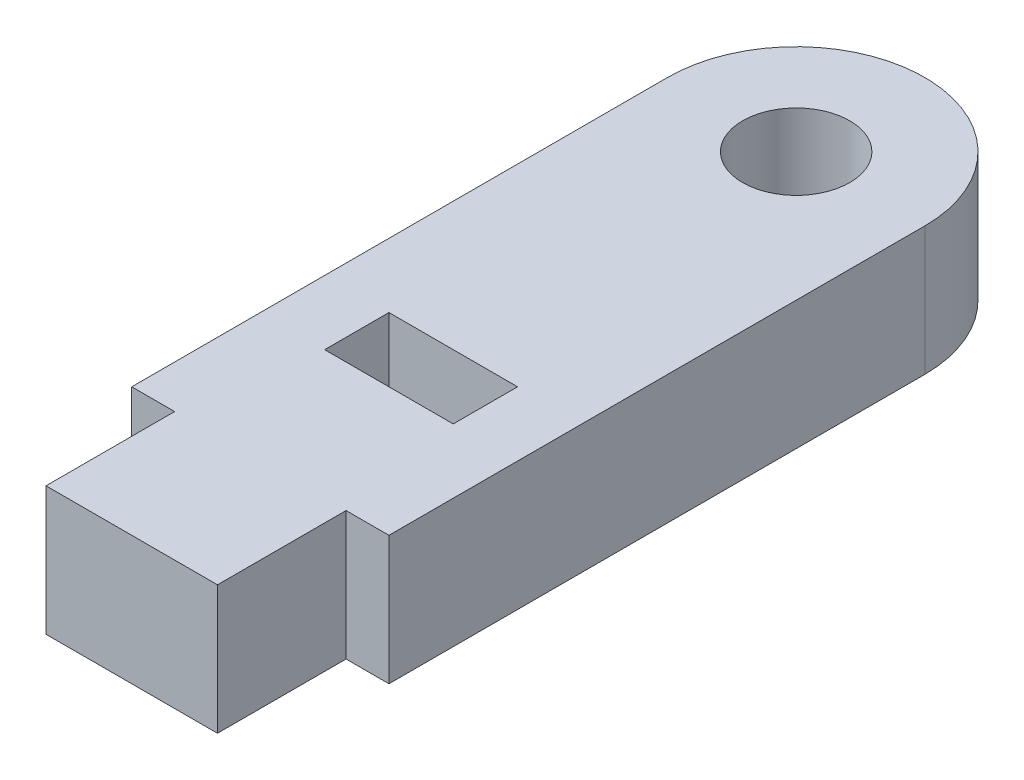
ISO-10303-21;
HEADER;
FILE_DESCRIPTION(('STEP AP214'),'2;1');
FILE_NAME('part.step','',(''),(''),'','','');
FILE_SCHEMA(('AUTOMOTIVE_DESIGN { 1 0 10303 214 1 1 1 1 }'));
ENDSEC;
DATA;
#1=APPLICATION_CONTEXT('core data for automotive mechanical design processes');
#2=APPLICATION_PROTOCOL_DEFINITION('international standard','automotive_design',2000,#1);
#3=PRODUCT_CONTEXT('',#1,'mechanical');
#4=PRODUCT('Part','Part','',(#3));
#5=PRODUCT_RELATED_PRODUCT_CATEGORY('part','',(#4));
#6=PRODUCT_DEFINITION_FORMATION('','',#4);
#7=PRODUCT_DEFINITION_CONTEXT('part definition',#1,'design');
#8=PRODUCT_DEFINITION('design','',#6,#7);
#9=PRODUCT_DEFINITION_SHAPE('','',#8);
#10=(LENGTH_UNIT() NAMED_UNIT(*) SI_UNIT(.MILLI.,.METRE.));
#11=(NAMED_UNIT(*) PLANE_ANGLE_UNIT() SI_UNIT($,.RADIAN.));
#12=(NAMED_UNIT(*) SI_UNIT($,.STERADIAN.) SOLID_ANGLE_UNIT());
#13=UNCERTAINTY_MEASURE_WITH_UNIT(LENGTH_MEASURE(1.E-05),#10,'distance_accuracy_value','');
#14=(GEOMETRIC_REPRESENTATION_CONTEXT(3) GLOBAL_UNCERTAINTY_ASSIGNED_CONTEXT((#13)) GLOBAL_UNIT_ASSIGNED_CONTEXT((#10,
#11,#12)) REPRESENTATION_CONTEXT('',''));
#15=CARTESIAN_POINT('',(0.,0.,0.));
#16=DIRECTION('',(0.,0.,1.));
#17=DIRECTION('',(1.,0.,0.));
#18=AXIS2_PLACEMENT_3D('',#15,#16,#17);
#19=CARTESIAN_POINT('',(0.,6.,0.));
#20=DIRECTION('',(0.,-1.,0.));
#21=DIRECTION('',(0.,0.,-1.));
#22=AXIS2_PLACEMENT_3D('',#19,#20,#21);
#23=PLANE('',#22);
#24=CARTESIAN_POINT('',(0.,6.,0.));
#25=DIRECTION('',(0.,1.,0.));
#26=DIRECTION('',(0.,0.,1.));
#27=AXIS2_PLACEMENT_3D('',#24,#25,#26);
#28=CIRCLE('',#27,2.5);
#29=CARTESIAN_POINT('',(0.,6.,2.5));
#30=VERTEX_POINT('',#29);
#31=EDGE_CURVE('E158',#30,#30,#28,.T.);
#32=ORIENTED_EDGE('',*,*,#31,.F.);
#33=EDGE_LOOP('',(#32));
#34=FACE_BOUND('',#33,.T.);
#35=CARTESIAN_POINT('',(0.,6.,0.));
#36=DIRECTION('',(0.,1.,0.));
#37=DIRECTION('',(0.,0.,-1.));
#38=AXIS2_PLACEMENT_3D('',#35,#36,#37);
#39=CIRCLE('',#38,6.);
#40=CARTESIAN_POINT('',(6.,6.,0.));
#41=VERTEX_POINT('',#40);
#42=CARTESIAN_POINT('',(-5.99999999999999,6.,0.));
#43=VERTEX_POINT('',#42);
#44=EDGE_CURVE('E164',#41,#43,#39,.T.);
#45=ORIENTED_EDGE('',*,*,#44,.T.);
#46=DIRECTION('',(0.,0.,1.));
#47=VECTOR('',#46,1.);
#48=CARTESIAN_POINT('',(-5.99999999999999,6.,0.));
#49=LINE('',#48,#47);
#50=CARTESIAN_POINT('',(-5.99999999999999,6.,25.));
#51=VERTEX_POINT('',#50);
#52=EDGE_CURVE('E167',#43,#51,#49,.T.);
#53=ORIENTED_EDGE('',*,*,#52,.T.);
#54=DIRECTION('',(1.,0.,0.));
#55=VECTOR('',#54,1.);
#56=CARTESIAN_POINT('',(-5.99999999999999,6.,25.));
#57=LINE('',#56,#55);
#58=CARTESIAN_POINT('',(-3.99999999999999,6.,25.));
#59=VERTEX_POINT('',#58);
#60=EDGE_CURVE('E170',#51,#59,#57,.T.);
#61=ORIENTED_EDGE('',*,*,#60,.T.);
#62=DIRECTION('',(0.,0.,1.));
#63=VECTOR('',#62,1.);
#64=CARTESIAN_POINT('',(-3.99999999999999,6.,25.));
#65=LINE('',#64,#63);
#66=CARTESIAN_POINT('',(-3.99999999999999,6.,31.));
#67=VERTEX_POINT('',#66);
#68=EDGE_CURVE('E172',#59,#67,#65,.T.);
#69=ORIENTED_EDGE('',*,*,#68,.T.);
#70=DIRECTION('',(1.,0.,0.));
#71=VECTOR('',#70,1.);
#72=CARTESIAN_POINT('',(-3.99999999999999,6.,31.));
#73=LINE('',#72,#71);
#74=CARTESIAN_POINT('',(4.00000000000001,6.,31.));
#75=VERTEX_POINT('',#74);
#76=EDGE_CURVE('E174',#67,#75,#73,.T.);
#77=ORIENTED_EDGE('',*,*,#76,.T.);
#78=DIRECTION('',(0.,0.,-1.));
#79=VECTOR('',#78,1.);
#80=CARTESIAN_POINT('',(4.00000000000001,6.,25.));
#81=LINE('',#80,#79);
#82=CARTESIAN_POINT('',(4.00000000000001,6.,25.));
#83=VERTEX_POINT('',#82);
#84=EDGE_CURVE('E176',#75,#83,#81,.T.);
#85=ORIENTED_EDGE('',*,*,#84,.T.);
#86=DIRECTION('',(1.,0.,0.));
#87=VECTOR('',#86,1.);
#88=CARTESIAN_POINT('',(4.00000000000001,6.,25.));
#89=LINE('',#88,#87);
#90=CARTESIAN_POINT('',(6.00000000000001,6.,25.));
#91=VERTEX_POINT('',#90);
#92=EDGE_CURVE('E178',#83,#91,#89,.T.);
#93=ORIENTED_EDGE('',*,*,#92,.T.);
#94=DIRECTION('',(0.,0.,-1.));
#95=VECTOR('',#94,1.);
#96=CARTESIAN_POINT('',(6.,6.,0.));
#97=LINE('',#96,#95);
#98=EDGE_CURVE('E180',#91,#41,#97,.T.);
#99=ORIENTED_EDGE('',*,*,#98,.T.);
#100=EDGE_LOOP('',(#45,#53,#61,#69,#77,#85,#93,#99));
#101=FACE_BOUND('',#100,.T.);
#102=DIRECTION('',(0.,0.,-1.));
#103=VECTOR('',#102,1.);
#104=CARTESIAN_POINT('',(3.00000000000001,6.,16.));
#105=LINE('',#104,#103);
#106=CARTESIAN_POINT('',(3.00000000000001,6.,19.));
#107=VERTEX_POINT('',#106);
#108=CARTESIAN_POINT('',(3.00000000000001,6.,16.));
#109=VERTEX_POINT('',#108);
#110=EDGE_CURVE('E122',#107,#109,#105,.T.);
#111=ORIENTED_EDGE('',*,*,#110,.F.);
#112=DIRECTION('',(1.,0.,0.));
#113=VECTOR('',#112,1.);
#114=CARTESIAN_POINT('',(-2.99999999999999,6.,19.));
#115=LINE('',#114,#113);
#116=CARTESIAN_POINT('',(-2.99999999999999,6.,19.));
#117=VERTEX_POINT('',#116);
#118=EDGE_CURVE('E144',#117,#107,#115,.T.);
#119=ORIENTED_EDGE('',*,*,#118,.F.);
#120=DIRECTION('',(0.,0.,1.));
#121=VECTOR('',#120,1.);
#122=CARTESIAN_POINT('',(-2.99999999999999,6.,16.));
#123=LINE('',#122,#121);
#124=CARTESIAN_POINT('',(-2.99999999999999,6.,16.));
#125=VERTEX_POINT('',#124);
#126=EDGE_CURVE('E142',#125,#117,#123,.T.);
#127=ORIENTED_EDGE('',*,*,#126,.F.);
#128=DIRECTION('',(-1.,0.,0.));
#129=VECTOR('',#128,1.);
#130=CARTESIAN_POINT('',(-2.99999999999999,6.,16.));
#131=LINE('',#130,#129);
#132=EDGE_CURVE('E130',#109,#125,#131,.T.);
#133=ORIENTED_EDGE('',*,*,#132,.F.);
#134=EDGE_LOOP('',(#111,#119,#127,#133));
#135=FACE_BOUND('',#134,.T.);
#136=ADVANCED_FACE('F33',(#34,#101,#135),#23,.F.);
#137=CARTESIAN_POINT('',(0.,0.,0.));
#138=DIRECTION('',(0.,-1.,0.));
#139=DIRECTION('',(0.,0.,-1.));
#140=AXIS2_PLACEMENT_3D('',#137,#138,#139);
#141=PLANE('',#140);
#142=CARTESIAN_POINT('',(0.,0.,0.));
#143=DIRECTION('',(0.,1.,0.));
#144=DIRECTION('',(0.,0.,-1.));
#145=AXIS2_PLACEMENT_3D('',#142,#143,#144);
#146=CIRCLE('',#145,6.);
#147=CARTESIAN_POINT('',(6.,0.,0.));
#148=VERTEX_POINT('',#147);
#149=CARTESIAN_POINT('',(-5.99999999999999,0.,0.));
#150=VERTEX_POINT('',#149);
#151=EDGE_CURVE('E161',#148,#150,#146,.T.);
#152=ORIENTED_EDGE('',*,*,#151,.F.);
#153=DIRECTION('',(0.,0.,-1.));
#154=VECTOR('',#153,1.);
#155=CARTESIAN_POINT('',(6.,0.,0.));
#156=LINE('',#155,#154);
#157=CARTESIAN_POINT('',(6.00000000000001,0.,25.));
#158=VERTEX_POINT('',#157);
#159=EDGE_CURVE('E168',#158,#148,#156,.T.);
#160=ORIENTED_EDGE('',*,*,#159,.F.);
#161=DIRECTION('',(1.,0.,0.));
#162=VECTOR('',#161,1.);
#163=CARTESIAN_POINT('',(4.00000000000001,0.,25.));
#164=LINE('',#163,#162);
#165=CARTESIAN_POINT('',(4.00000000000001,0.,25.));
#166=VERTEX_POINT('',#165);
#167=EDGE_CURVE('E195',#166,#158,#164,.T.);
#168=ORIENTED_EDGE('',*,*,#167,.F.);
#169=DIRECTION('',(0.,0.,-1.));
#170=VECTOR('',#169,1.);
#171=CARTESIAN_POINT('',(4.00000000000001,0.,25.));
#172=LINE('',#171,#170);
#173=CARTESIAN_POINT('',(4.00000000000001,0.,31.));
#174=VERTEX_POINT('',#173);
#175=EDGE_CURVE('E193',#174,#166,#172,.T.);
#176=ORIENTED_EDGE('',*,*,#175,.F.);
#177=DIRECTION('',(1.,0.,0.));
#178=VECTOR('',#177,1.);
#179=CARTESIAN_POINT('',(-3.99999999999999,0.,31.));
#180=LINE('',#179,#178);
#181=CARTESIAN_POINT('',(-3.99999999999999,0.,31.));
#182=VERTEX_POINT('',#181);
#183=EDGE_CURVE('E191',#182,#174,#180,.T.);
#184=ORIENTED_EDGE('',*,*,#183,.F.);
#185=DIRECTION('',(0.,0.,1.));
#186=VECTOR('',#185,1.);
#187=CARTESIAN_POINT('',(-3.99999999999999,0.,25.));
#188=LINE('',#187,#186);
#189=CARTESIAN_POINT('',(-3.99999999999999,0.,25.));
#190=VERTEX_POINT('',#189);
#191=EDGE_CURVE('E189',#190,#182,#188,.T.);
#192=ORIENTED_EDGE('',*,*,#191,.F.);
#193=DIRECTION('',(1.,0.,0.));
#194=VECTOR('',#193,1.);
#195=CARTESIAN_POINT('',(-5.99999999999999,0.,25.));
#196=LINE('',#195,#194);
#197=CARTESIAN_POINT('',(-5.99999999999999,0.,25.));
#198=VERTEX_POINT('',#197);
#199=EDGE_CURVE('E187',#198,#190,#196,.T.);
#200=ORIENTED_EDGE('',*,*,#199,.F.);
#201=DIRECTION('',(0.,0.,1.));
#202=VECTOR('',#201,1.);
#203=CARTESIAN_POINT('',(-5.99999999999999,0.,0.));
#204=LINE('',#203,#202);
#205=EDGE_CURVE('E185',#150,#198,#204,.T.);
#206=ORIENTED_EDGE('',*,*,#205,.F.);
#207=EDGE_LOOP('',(#152,#160,#168,#176,#184,#192,#200,#206));
#208=FACE_BOUND('',#207,.T.);
#209=CARTESIAN_POINT('',(0.,0.,0.));
#210=DIRECTION('',(0.,1.,0.));
#211=DIRECTION('',(0.,0.,1.));
#212=AXIS2_PLACEMENT_3D('',#209,#210,#211);
#213=CIRCLE('',#212,2.5);
#214=CARTESIAN_POINT('',(0.,0.,2.5));
#215=VERTEX_POINT('',#214);
#216=EDGE_CURVE('E138',#215,#215,#213,.T.);
#217=ORIENTED_EDGE('',*,*,#216,.T.);
#218=EDGE_LOOP('',(#217));
#219=FACE_BOUND('',#218,.T.);
#220=DIRECTION('',(1.,0.,0.));
#221=VECTOR('',#220,1.);
#222=CARTESIAN_POINT('',(-2.99999999999999,0.,19.));
#223=LINE('',#222,#221);
#224=CARTESIAN_POINT('',(-2.99999999999999,0.,19.));
#225=VERTEX_POINT('',#224);
#226=CARTESIAN_POINT('',(3.00000000000001,0.,19.));
#227=VERTEX_POINT('',#226);
#228=EDGE_CURVE('E131',#225,#227,#223,.T.);
#229=ORIENTED_EDGE('',*,*,#228,.T.);
#230=DIRECTION('',(0.,0.,-1.));
#231=VECTOR('',#230,1.);
#232=CARTESIAN_POINT('',(3.00000000000001,0.,16.));
#233=LINE('',#232,#231);
#234=CARTESIAN_POINT('',(3.00000000000001,0.,16.));
#235=VERTEX_POINT('',#234);
#236=EDGE_CURVE('E56',#227,#235,#233,.T.);
#237=ORIENTED_EDGE('',*,*,#236,.T.);
#238=DIRECTION('',(-1.,0.,0.));
#239=VECTOR('',#238,1.);
#240=CARTESIAN_POINT('',(-2.99999999999999,0.,16.));
#241=LINE('',#240,#239);
#242=CARTESIAN_POINT('',(-2.99999999999999,0.,16.));
#243=VERTEX_POINT('',#242);
#244=EDGE_CURVE('E137',#235,#243,#241,.T.);
#245=ORIENTED_EDGE('',*,*,#244,.T.);
#246=DIRECTION('',(0.,0.,1.));
#247=VECTOR('',#246,1.);
#248=CARTESIAN_POINT('',(-2.99999999999999,0.,16.));
#249=LINE('',#248,#247);
#250=EDGE_CURVE('E150',#243,#225,#249,.T.);
#251=ORIENTED_EDGE('',*,*,#250,.T.);
#252=EDGE_LOOP('',(#229,#237,#245,#251));
#253=FACE_BOUND('',#252,.T.);
#254=ADVANCED_FACE('F225',(#208,#219,#253),#141,.T.);
#255=CARTESIAN_POINT('',(0.,6.,0.));
#256=DIRECTION('',(0.,-1.,0.));
#257=DIRECTION('',(0.,0.,-1.));
#258=AXIS2_PLACEMENT_3D('',#255,#256,#257);
#259=CYLINDRICAL_SURFACE('',#258,6.);
#260=ORIENTED_EDGE('',*,*,#151,.T.);
#261=DIRECTION('',(0.,-1.,0.));
#262=VECTOR('',#261,1.);
#263=CARTESIAN_POINT('',(-5.99999999999999,6.,0.));
#264=LINE('',#263,#262);
#265=EDGE_CURVE('E11',#43,#150,#264,.T.);
#266=ORIENTED_EDGE('',*,*,#265,.F.);
#267=ORIENTED_EDGE('',*,*,#44,.F.);
#268=DIRECTION('',(0.,-1.,0.));
#269=VECTOR('',#268,1.);
#270=CARTESIAN_POINT('',(6.,6.,0.));
#271=LINE('',#270,#269);
#272=EDGE_CURVE('E182',#41,#148,#271,.T.);
#273=ORIENTED_EDGE('',*,*,#272,.T.);
#274=EDGE_LOOP('',(#260,#266,#267,#273));
#275=FACE_BOUND('',#274,.T.);
#276=ADVANCED_FACE('F35',(#275),#259,.T.);
#277=CARTESIAN_POINT('',(-5.99999999999999,6.,0.));
#278=DIRECTION('',(1.,0.,0.));
#279=DIRECTION('',(0.,0.,-1.));
#280=AXIS2_PLACEMENT_3D('',#277,#278,#279);
#281=PLANE('',#280);
#282=ORIENTED_EDGE('',*,*,#205,.T.);
#283=DIRECTION('',(0.,-1.,0.));
#284=VECTOR('',#283,1.);
#285=CARTESIAN_POINT('',(-5.99999999999999,6.,25.));
#286=LINE('',#285,#284);
#287=EDGE_CURVE('E41',#51,#198,#286,.T.);
#288=ORIENTED_EDGE('',*,*,#287,.F.);
#289=ORIENTED_EDGE('',*,*,#52,.F.);
#290=ORIENTED_EDGE('',*,*,#265,.T.);
#291=EDGE_LOOP('',(#282,#288,#289,#290));
#292=FACE_BOUND('',#291,.T.);
#293=ADVANCED_FACE('F242',(#292),#281,.F.);
#294=CARTESIAN_POINT('',(-5.99999999999999,6.,25.));
#295=DIRECTION('',(0.,0.,-1.));
#296=DIRECTION('',(-1.,0.,0.));
#297=AXIS2_PLACEMENT_3D('',#294,#295,#296);
#298=PLANE('',#297);
#299=ORIENTED_EDGE('',*,*,#199,.T.);
#300=DIRECTION('',(0.,-1.,0.));
#301=VECTOR('',#300,1.);
#302=CARTESIAN_POINT('',(-3.99999999999999,6.,25.));
#303=LINE('',#302,#301);
#304=EDGE_CURVE('E212',#59,#190,#303,.T.);
#305=ORIENTED_EDGE('',*,*,#304,.F.);
#306=ORIENTED_EDGE('',*,*,#60,.F.);
#307=ORIENTED_EDGE('',*,*,#287,.T.);
#308=EDGE_LOOP('',(#299,#305,#306,#307));
#309=FACE_BOUND('',#308,.T.);
#310=ADVANCED_FACE('F219',(#309),#298,.F.);
#311=CARTESIAN_POINT('',(-3.99999999999999,6.,25.));
#312=DIRECTION('',(1.,0.,0.));
#313=DIRECTION('',(0.,0.,-1.));
#314=AXIS2_PLACEMENT_3D('',#311,#312,#313);
#315=PLANE('',#314);
#316=ORIENTED_EDGE('',*,*,#191,.T.);
#317=DIRECTION('',(0.,-1.,0.));
#318=VECTOR('',#317,1.);
#319=CARTESIAN_POINT('',(-3.99999999999999,6.,31.));
#320=LINE('',#319,#318);
#321=EDGE_CURVE('E209',#67,#182,#320,.T.);
#322=ORIENTED_EDGE('',*,*,#321,.F.);
#323=ORIENTED_EDGE('',*,*,#68,.F.);
#324=ORIENTED_EDGE('',*,*,#304,.T.);
#325=EDGE_LOOP('',(#316,#322,#323,#324));
#326=FACE_BOUND('',#325,.T.);
#327=ADVANCED_FACE('F231',(#326),#315,.F.);
#328=CARTESIAN_POINT('',(-3.99999999999999,6.,31.));
#329=DIRECTION('',(0.,0.,-1.));
#330=DIRECTION('',(-1.,0.,0.));
#331=AXIS2_PLACEMENT_3D('',#328,#329,#330);
#332=PLANE('',#331);
#333=ORIENTED_EDGE('',*,*,#183,.T.);
#334=DIRECTION('',(0.,-1.,0.));
#335=VECTOR('',#334,1.);
#336=CARTESIAN_POINT('',(4.00000000000001,6.,31.));
#337=LINE('',#336,#335);
#338=EDGE_CURVE('E206',#75,#174,#337,.T.);
#339=ORIENTED_EDGE('',*,*,#338,.F.);
#340=ORIENTED_EDGE('',*,*,#76,.F.);
#341=ORIENTED_EDGE('',*,*,#321,.T.);
#342=EDGE_LOOP('',(#333,#339,#340,#341));
#343=FACE_BOUND('',#342,.T.);
#344=ADVANCED_FACE('F235',(#343),#332,.F.);
#345=CARTESIAN_POINT('',(4.00000000000001,6.,25.));
#346=DIRECTION('',(-1.,0.,0.));
#347=DIRECTION('',(0.,0.,1.));
#348=AXIS2_PLACEMENT_3D('',#345,#346,#347);
#349=PLANE('',#348);
#350=ORIENTED_EDGE('',*,*,#175,.T.);
#351=DIRECTION('',(0.,-1.,0.));
#352=VECTOR('',#351,1.);
#353=CARTESIAN_POINT('',(4.00000000000001,6.,25.));
#354=LINE('',#353,#352);
#355=EDGE_CURVE('E203',#83,#166,#354,.T.);
#356=ORIENTED_EDGE('',*,*,#355,.F.);
#357=ORIENTED_EDGE('',*,*,#84,.F.);
#358=ORIENTED_EDGE('',*,*,#338,.T.);
#359=EDGE_LOOP('',(#350,#356,#357,#358));
#360=FACE_BOUND('',#359,.T.);
#361=ADVANCED_FACE('F255',(#360),#349,.F.);
#362=CARTESIAN_POINT('',(4.00000000000001,6.,25.));
#363=DIRECTION('',(0.,0.,-1.));
#364=DIRECTION('',(-1.,0.,0.));
#365=AXIS2_PLACEMENT_3D('',#362,#363,#364);
#366=PLANE('',#365);
#367=ORIENTED_EDGE('',*,*,#167,.T.);
#368=DIRECTION('',(0.,-1.,0.));
#369=VECTOR('',#368,1.);
#370=CARTESIAN_POINT('',(6.00000000000001,6.,25.));
#371=LINE('',#370,#369);
#372=EDGE_CURVE('E200',#91,#158,#371,.T.);
#373=ORIENTED_EDGE('',*,*,#372,.F.);
#374=ORIENTED_EDGE('',*,*,#92,.F.);
#375=ORIENTED_EDGE('',*,*,#355,.T.);
#376=EDGE_LOOP('',(#367,#373,#374,#375));
#377=FACE_BOUND('',#376,.T.);
#378=ADVANCED_FACE('F253',(#377),#366,.F.);
#379=CARTESIAN_POINT('',(6.,6.,0.));
#380=DIRECTION('',(-1.,0.,0.));
#381=DIRECTION('',(0.,0.,1.));
#382=AXIS2_PLACEMENT_3D('',#379,#380,#381);
#383=PLANE('',#382);
#384=ORIENTED_EDGE('',*,*,#159,.T.);
#385=ORIENTED_EDGE('',*,*,#272,.F.);
#386=ORIENTED_EDGE('',*,*,#98,.F.);
#387=ORIENTED_EDGE('',*,*,#372,.T.);
#388=EDGE_LOOP('',(#384,#385,#386,#387));
#389=FACE_BOUND('',#388,.T.);
#390=ADVANCED_FACE('F248',(#389),#383,.F.);
#391=CARTESIAN_POINT('',(0.,6.,0.));
#392=DIRECTION('',(0.,-1.,0.));
#393=DIRECTION('',(0.,0.,-1.));
#394=AXIS2_PLACEMENT_3D('',#391,#392,#393);
#395=CYLINDRICAL_SURFACE('',#394,2.5);
#396=ORIENTED_EDGE('',*,*,#31,.T.);
#397=EDGE_LOOP('',(#396));
#398=FACE_BOUND('',#397,.T.);
#399=ORIENTED_EDGE('',*,*,#216,.F.);
#400=EDGE_LOOP('',(#399));
#401=FACE_BOUND('',#400,.T.);
#402=ADVANCED_FACE('F273',(#398,#401),#395,.F.);
#403=CARTESIAN_POINT('',(3.00000000000001,6.,16.));
#404=DIRECTION('',(-1.,0.,0.));
#405=DIRECTION('',(0.,0.,1.));
#406=AXIS2_PLACEMENT_3D('',#403,#404,#405);
#407=PLANE('',#406);
#408=ORIENTED_EDGE('',*,*,#236,.F.);
#409=DIRECTION('',(0.,-1.,0.));
#410=VECTOR('',#409,1.);
#411=CARTESIAN_POINT('',(3.00000000000001,6.,19.));
#412=LINE('',#411,#410);
#413=EDGE_CURVE('E126',#107,#227,#412,.T.);
#414=ORIENTED_EDGE('',*,*,#413,.F.);
#415=ORIENTED_EDGE('',*,*,#110,.T.);
#416=DIRECTION('',(0.,-1.,0.));
#417=VECTOR('',#416,1.);
#418=CARTESIAN_POINT('',(3.00000000000001,6.,16.));
#419=LINE('',#418,#417);
#420=EDGE_CURVE('E125',#109,#235,#419,.T.);
#421=ORIENTED_EDGE('',*,*,#420,.T.);
#422=EDGE_LOOP('',(#408,#414,#415,#421));
#423=FACE_BOUND('',#422,.T.);
#424=ADVANCED_FACE('F124',(#423),#407,.T.);
#425=CARTESIAN_POINT('',(-2.99999999999999,6.,16.));
#426=DIRECTION('',(0.,0.,1.));
#427=DIRECTION('',(1.,0.,0.));
#428=AXIS2_PLACEMENT_3D('',#425,#426,#427);
#429=PLANE('',#428);
#430=ORIENTED_EDGE('',*,*,#244,.F.);
#431=ORIENTED_EDGE('',*,*,#420,.F.);
#432=ORIENTED_EDGE('',*,*,#132,.T.);
#433=DIRECTION('',(0.,-1.,0.));
#434=VECTOR('',#433,1.);
#435=CARTESIAN_POINT('',(-2.99999999999999,6.,16.));
#436=LINE('',#435,#434);
#437=EDGE_CURVE('E139',#125,#243,#436,.T.);
#438=ORIENTED_EDGE('',*,*,#437,.T.);
#439=EDGE_LOOP('',(#430,#431,#432,#438));
#440=FACE_BOUND('',#439,.T.);
#441=ADVANCED_FACE('F134',(#440),#429,.T.);
#442=CARTESIAN_POINT('',(-2.99999999999999,6.,16.));
#443=DIRECTION('',(1.,0.,0.));
#444=DIRECTION('',(0.,0.,-1.));
#445=AXIS2_PLACEMENT_3D('',#442,#443,#444);
#446=PLANE('',#445);
#447=ORIENTED_EDGE('',*,*,#250,.F.);
#448=ORIENTED_EDGE('',*,*,#437,.F.);
#449=ORIENTED_EDGE('',*,*,#126,.T.);
#450=DIRECTION('',(0.,-1.,0.));
#451=VECTOR('',#450,1.);
#452=CARTESIAN_POINT('',(-2.99999999999999,6.,19.));
#453=LINE('',#452,#451);
#454=EDGE_CURVE('E48',#117,#225,#453,.T.);
#455=ORIENTED_EDGE('',*,*,#454,.T.);
#456=EDGE_LOOP('',(#447,#448,#449,#455));
#457=FACE_BOUND('',#456,.T.);
#458=ADVANCED_FACE('F290',(#457),#446,.T.);
#459=CARTESIAN_POINT('',(-2.99999999999999,6.,19.));
#460=DIRECTION('',(0.,0.,-1.));
#461=DIRECTION('',(-1.,0.,0.));
#462=AXIS2_PLACEMENT_3D('',#459,#460,#461);
#463=PLANE('',#462);
#464=ORIENTED_EDGE('',*,*,#228,.F.);
#465=ORIENTED_EDGE('',*,*,#454,.F.);
#466=ORIENTED_EDGE('',*,*,#118,.T.);
#467=ORIENTED_EDGE('',*,*,#413,.T.);
#468=EDGE_LOOP('',(#464,#465,#466,#467));
#469=FACE_BOUND('',#468,.T.);
#470=ADVANCED_FACE('F288',(#469),#463,.T.);
#471=CLOSED_SHELL('',(#136,#254,#276,#293,#310,#327,#344,#361,#378,#390,#402,#424,#441,#458,#470));
#472=MANIFOLD_SOLID_BREP('B2',#471);
#473=ADVANCED_BREP_SHAPE_REPRESENTATION('',(#18,#472),#14);
#474=SHAPE_DEFINITION_REPRESENTATION(#9,#473);
ENDSEC;
END-ISO-10303-21;
